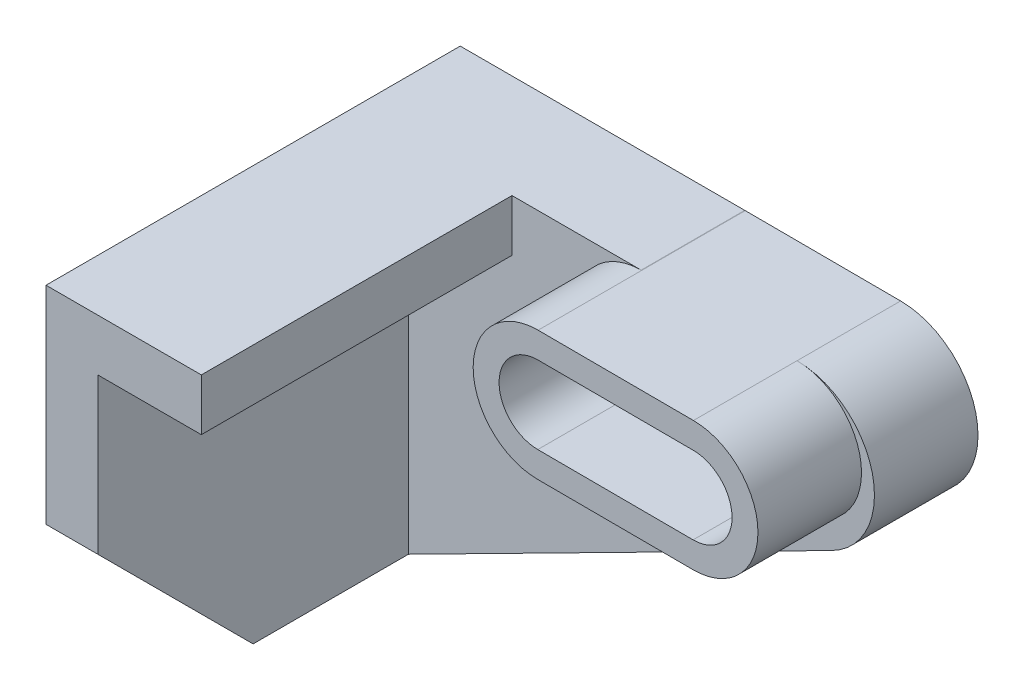
ISO-10303-21;
HEADER;
FILE_DESCRIPTION(('STEP AP214'),'2;1');
FILE_NAME('part.step','',(''),(''),'','','');
FILE_SCHEMA(('AUTOMOTIVE_DESIGN { 1 0 10303 214 1 1 1 1 }'));
ENDSEC;
DATA;
#1=APPLICATION_CONTEXT('core data for automotive mechanical design processes');
#2=APPLICATION_PROTOCOL_DEFINITION('international standard','automotive_design',2000,#1);
#3=PRODUCT_CONTEXT('',#1,'mechanical');
#4=PRODUCT('Part','Part','',(#3));
#5=PRODUCT_RELATED_PRODUCT_CATEGORY('part','',(#4));
#6=PRODUCT_DEFINITION_FORMATION('','',#4);
#7=PRODUCT_DEFINITION_CONTEXT('part definition',#1,'design');
#8=PRODUCT_DEFINITION('design','',#6,#7);
#9=PRODUCT_DEFINITION_SHAPE('','',#8);
#10=(LENGTH_UNIT() NAMED_UNIT(*) SI_UNIT(.MILLI.,.METRE.));
#11=(NAMED_UNIT(*) PLANE_ANGLE_UNIT() SI_UNIT($,.RADIAN.));
#12=(NAMED_UNIT(*) SI_UNIT($,.STERADIAN.) SOLID_ANGLE_UNIT());
#13=UNCERTAINTY_MEASURE_WITH_UNIT(LENGTH_MEASURE(1.E-05),#10,'distance_accuracy_value','');
#14=(GEOMETRIC_REPRESENTATION_CONTEXT(3) GLOBAL_UNCERTAINTY_ASSIGNED_CONTEXT((#13)) GLOBAL_UNIT_ASSIGNED_CONTEXT((#10,
#11,#12)) REPRESENTATION_CONTEXT('',''));
#15=CARTESIAN_POINT('',(0.,0.,0.));
#16=DIRECTION('',(0.,0.,1.));
#17=DIRECTION('',(1.,0.,0.));
#18=AXIS2_PLACEMENT_3D('',#15,#16,#17);
#19=CARTESIAN_POINT('',(0.,15.1056589097751,20.));
#20=DIRECTION('',(0.,-1.,0.));
#21=DIRECTION('',(1.,0.,0.));
#22=AXIS2_PLACEMENT_3D('',#19,#20,#21);
#23=PLANE('',#22);
#24=DIRECTION('',(0.,0.,-1.));
#25=VECTOR('',#24,1.);
#26=CARTESIAN_POINT('',(-30.0522937747598,15.1056589097751,40.));
#27=LINE('',#26,#25);
#28=CARTESIAN_POINT('',(-30.0522937747598,15.1056589097751,0.));
#29=VERTEX_POINT('',#28);
#30=CARTESIAN_POINT('',(-30.0522937747598,15.1056589097751,20.));
#31=VERTEX_POINT('',#30);
#32=EDGE_CURVE('E231',#29,#31,#27,.F.);
#33=ORIENTED_EDGE('',*,*,#32,.F.);
#34=DIRECTION('',(-1.,0.,0.));
#35=VECTOR('',#34,1.);
#36=CARTESIAN_POINT('',(0.,15.1056589097751,0.));
#37=LINE('',#36,#35);
#38=CARTESIAN_POINT('',(-85.,15.1056589097751,0.));
#39=VERTEX_POINT('',#38);
#40=EDGE_CURVE('E282',#29,#39,#37,.T.);
#41=ORIENTED_EDGE('',*,*,#40,.T.);
#42=DIRECTION('',(0.,0.,-1.));
#43=VECTOR('',#42,1.);
#44=CARTESIAN_POINT('',(-85.,15.1056589097751,80.));
#45=LINE('',#44,#43);
#46=CARTESIAN_POINT('',(-85.,15.1056589097751,80.));
#47=VERTEX_POINT('',#46);
#48=EDGE_CURVE('E271',#47,#39,#45,.T.);
#49=ORIENTED_EDGE('',*,*,#48,.F.);
#50=DIRECTION('',(-1.,0.,0.));
#51=VECTOR('',#50,1.);
#52=CARTESIAN_POINT('',(-55.,15.1056589097751,80.));
#53=LINE('',#52,#51);
#54=CARTESIAN_POINT('',(-55.,15.1056589097751,80.));
#55=VERTEX_POINT('',#54);
#56=EDGE_CURVE('E247',#55,#47,#53,.T.);
#57=ORIENTED_EDGE('',*,*,#56,.F.);
#58=DIRECTION('',(0.,0.,-1.));
#59=VECTOR('',#58,1.);
#60=CARTESIAN_POINT('',(-55.,15.1056589097751,80.));
#61=LINE('',#60,#59);
#62=CARTESIAN_POINT('',(-55.,15.1056589097751,20.));
#63=VERTEX_POINT('',#62);
#64=EDGE_CURVE('E274',#55,#63,#61,.T.);
#65=ORIENTED_EDGE('',*,*,#64,.T.);
#66=DIRECTION('',(-1.,0.,0.));
#67=VECTOR('',#66,1.);
#68=CARTESIAN_POINT('',(0.,15.1056589097751,20.));
#69=LINE('',#68,#67);
#70=EDGE_CURVE('E287',#31,#63,#69,.T.);
#71=ORIENTED_EDGE('',*,*,#70,.F.);
#72=EDGE_LOOP('',(#33,#41,#49,#57,#65,#71));
#73=FACE_BOUND('',#72,.T.);
#74=ADVANCED_FACE('F35',(#73),#23,.F.);
#75=CARTESIAN_POINT('',(0.,0.,20.));
#76=DIRECTION('',(0.,0.,1.));
#77=DIRECTION('',(1.,0.,0.));
#78=AXIS2_PLACEMENT_3D('',#75,#76,#77);
#79=PLANE('',#78);
#80=CARTESIAN_POINT('',(0.,0.,20.));
#81=DIRECTION('',(0.,0.,1.));
#82=DIRECTION('',(1.,0.,0.));
#83=AXIS2_PLACEMENT_3D('',#80,#81,#82);
#84=CIRCLE('',#83,15.);
#85=CARTESIAN_POINT('',(6.78973399532052,-13.3753322303705,20.));
#86=VERTEX_POINT('',#85);
#87=CARTESIAN_POINT('',(0.0528760398409213,14.9999036972708,20.));
#88=VERTEX_POINT('',#87);
#89=EDGE_CURVE('E281',#86,#88,#84,.T.);
#90=ORIENTED_EDGE('',*,*,#89,.T.);
#91=CARTESIAN_POINT('',(0.,2.50001553279464,20.));
#92=DIRECTION('',(0.,0.,1.));
#93=DIRECTION('',(1.,0.,0.));
#94=AXIS2_PLACEMENT_3D('',#91,#92,#93);
#95=CIRCLE('',#94,12.5);
#96=CARTESIAN_POINT('',(-0.0440633774849681,-9.99990680371469,20.));
#97=VERTEX_POINT('',#96);
#98=EDGE_CURVE('E233',#88,#97,#95,.F.);
#99=ORIENTED_EDGE('',*,*,#98,.T.);
#100=DIRECTION('',(-0.999993786920746,0.00352507019879746,0.));
#101=VECTOR('',#100,1.);
#102=CARTESIAN_POINT('',(-0.0352507019879747,-9.99993786920746,20.));
#103=LINE('',#102,#101);
#104=CARTESIAN_POINT('',(-30.044063377485,-9.89415404070046,20.));
#105=VERTEX_POINT('',#104);
#106=EDGE_CURVE('E225',#97,#105,#103,.T.);
#107=ORIENTED_EDGE('',*,*,#106,.T.);
#108=CARTESIAN_POINT('',(-30.,2.60576829580886,20.));
#109=DIRECTION('',(0.,0.,1.));
#110=DIRECTION('',(1.,0.,0.));
#111=AXIS2_PLACEMENT_3D('',#108,#109,#110);
#112=CIRCLE('',#111,12.5);
#113=EDGE_CURVE('E228',#105,#31,#112,.F.);
#114=ORIENTED_EDGE('',*,*,#113,.T.);
#115=ORIENTED_EDGE('',*,*,#70,.T.);
#116=DIRECTION('',(0.,-1.,0.));
#117=VECTOR('',#116,1.);
#118=CARTESIAN_POINT('',(-55.,0.,20.));
#119=LINE('',#118,#117);
#120=CARTESIAN_POINT('',(-55.,5.10565890977509,20.));
#121=VERTEX_POINT('',#120);
#122=EDGE_CURVE('E289',#63,#121,#119,.T.);
#123=ORIENTED_EDGE('',*,*,#122,.T.);
#124=DIRECTION('',(-1.,0.,0.));
#125=VECTOR('',#124,1.);
#126=CARTESIAN_POINT('',(0.,5.1056589097751,20.));
#127=LINE('',#126,#125);
#128=CARTESIAN_POINT('',(-75.,5.10565890977509,20.));
#129=VERTEX_POINT('',#128);
#130=EDGE_CURVE('E291',#121,#129,#127,.T.);
#131=ORIENTED_EDGE('',*,*,#130,.T.);
#132=DIRECTION('',(0.,-1.,0.));
#133=VECTOR('',#132,1.);
#134=CARTESIAN_POINT('',(-75.,0.,20.));
#135=LINE('',#134,#133);
#136=CARTESIAN_POINT('',(-75.,-54.8943410902249,20.));
#137=VERTEX_POINT('',#136);
#138=EDGE_CURVE('E293',#129,#137,#135,.T.);
#139=ORIENTED_EDGE('',*,*,#138,.T.);
#140=DIRECTION('',(0.891688815358036,0.452648933021368,0.));
#141=VECTOR('',#140,1.);
#142=CARTESIAN_POINT('',(6.78973399532052,-13.3753322303705,20.));
#143=LINE('',#142,#141);
#144=EDGE_CURVE('E278',#137,#86,#143,.T.);
#145=ORIENTED_EDGE('',*,*,#144,.T.);
#146=EDGE_LOOP('',(#90,#99,#107,#114,#115,#123,#131,#139,#145));
#147=FACE_BOUND('',#146,.T.);
#148=ADVANCED_FACE('F338',(#147),#79,.T.);
#149=CARTESIAN_POINT('',(6.78973399532052,-13.3753322303705,20.));
#150=DIRECTION('',(-0.452648933021368,0.891688815358036,0.));
#151=DIRECTION('',(-0.891688815358036,-0.452648933021368,0.));
#152=AXIS2_PLACEMENT_3D('',#149,#150,#151);
#153=PLANE('',#152);
#154=DIRECTION('',(0.891688815358036,0.452648933021368,0.));
#155=VECTOR('',#154,1.);
#156=CARTESIAN_POINT('',(6.78973399532052,-13.3753322303705,0.));
#157=LINE('',#156,#155);
#158=CARTESIAN_POINT('',(-75.,-54.8943410902249,0.));
#159=VERTEX_POINT('',#158);
#160=CARTESIAN_POINT('',(6.78973399532052,-13.3753322303705,0.));
#161=VERTEX_POINT('',#160);
#162=EDGE_CURVE('E277',#159,#161,#157,.T.);
#163=ORIENTED_EDGE('',*,*,#162,.T.);
#164=DIRECTION('',(0.,0.,-1.));
#165=VECTOR('',#164,1.);
#166=CARTESIAN_POINT('',(6.78973399532052,-13.3753322303705,20.));
#167=LINE('',#166,#165);
#168=EDGE_CURVE('E43',#86,#161,#167,.T.);
#169=ORIENTED_EDGE('',*,*,#168,.F.);
#170=ORIENTED_EDGE('',*,*,#144,.F.);
#171=DIRECTION('',(0.,0.,-1.));
#172=VECTOR('',#171,1.);
#173=CARTESIAN_POINT('',(-75.,-54.8943410902249,20.));
#174=LINE('',#173,#172);
#175=EDGE_CURVE('E296',#137,#159,#174,.T.);
#176=ORIENTED_EDGE('',*,*,#175,.T.);
#177=EDGE_LOOP('',(#163,#169,#170,#176));
#178=FACE_BOUND('',#177,.T.);
#179=ADVANCED_FACE('F37',(#178),#153,.F.);
#180=CARTESIAN_POINT('',(0.,0.,20.));
#181=DIRECTION('',(0.,0.,-1.));
#182=DIRECTION('',(-1.,0.,0.));
#183=AXIS2_PLACEMENT_3D('',#180,#181,#182);
#184=CYLINDRICAL_SURFACE('',#183,15.);
#185=CARTESIAN_POINT('',(0.,0.,0.));
#186=DIRECTION('',(0.,0.,1.));
#187=DIRECTION('',(1.,0.,0.));
#188=AXIS2_PLACEMENT_3D('',#185,#186,#187);
#189=CIRCLE('',#188,15.);
#190=CARTESIAN_POINT('',(0.0528760529819632,14.9999068038112,0.));
#191=VERTEX_POINT('',#190);
#192=EDGE_CURVE('E299',#161,#191,#189,.T.);
#193=ORIENTED_EDGE('',*,*,#192,.T.);
#194=DIRECTION('',(0.,0.,-1.));
#195=VECTOR('',#194,1.);
#196=CARTESIAN_POINT('',(0.0528760529819632,14.9999068038112,20.));
#197=LINE('',#196,#195);
#198=EDGE_CURVE('E305',#88,#191,#197,.T.);
#199=ORIENTED_EDGE('',*,*,#198,.F.);
#200=ORIENTED_EDGE('',*,*,#89,.F.);
#201=ORIENTED_EDGE('',*,*,#168,.T.);
#202=EDGE_LOOP('',(#193,#199,#200,#201));
#203=FACE_BOUND('',#202,.T.);
#204=ADVANCED_FACE('F310',(#203),#184,.T.);
#205=CARTESIAN_POINT('',(0.052876052981962,14.9999068038112,20.));
#206=DIRECTION('',(-0.00352507019879747,-0.999993786920746,0.));
#207=DIRECTION('',(0.999993786920746,-0.00352507019879747,0.));
#208=AXIS2_PLACEMENT_3D('',#205,#206,#207);
#209=PLANE('',#208);
#210=DIRECTION('',(-0.999993786920746,0.00352507019879747,0.));
#211=VECTOR('',#210,1.);
#212=CARTESIAN_POINT('',(0.052876052981962,14.9999068038112,0.));
#213=LINE('',#212,#211);
#214=CARTESIAN_POINT('',(-29.955936622515,15.1056906323182,0.));
#215=VERTEX_POINT('',#214);
#216=EDGE_CURVE('E301',#191,#215,#213,.T.);
#217=ORIENTED_EDGE('',*,*,#216,.T.);
#218=DIRECTION('',(0.,0.,-1.));
#219=VECTOR('',#218,1.);
#220=CARTESIAN_POINT('',(-29.955936622515,15.1056906323182,40.));
#221=LINE('',#220,#219);
#222=CARTESIAN_POINT('',(-29.955936622515,15.1056906323182,40.));
#223=VERTEX_POINT('',#222);
#224=EDGE_CURVE('E211',#223,#215,#221,.T.);
#225=ORIENTED_EDGE('',*,*,#224,.F.);
#226=DIRECTION('',(-0.999993786920745,0.00352507019879764,0.));
#227=VECTOR('',#226,1.);
#228=CARTESIAN_POINT('',(0.0440633774849681,14.999937869304,40.));
#229=LINE('',#228,#227);
#230=CARTESIAN_POINT('',(0.0440633774849681,14.999937869304,40.));
#231=VERTEX_POINT('',#230);
#232=EDGE_CURVE('E200',#231,#223,#229,.T.);
#233=ORIENTED_EDGE('',*,*,#232,.F.);
#234=DIRECTION('',(0.,0.,-1.));
#235=VECTOR('',#234,1.);
#236=CARTESIAN_POINT('',(0.0440633774849681,14.999937869304,40.));
#237=LINE('',#236,#235);
#238=CARTESIAN_POINT('',(0.0440633774849681,14.999937869304,20.));
#239=VERTEX_POINT('',#238);
#240=EDGE_CURVE('E214',#231,#239,#237,.T.);
#241=ORIENTED_EDGE('',*,*,#240,.T.);
#242=DIRECTION('',(-0.999993786920746,0.00352507019879747,0.));
#243=VECTOR('',#242,1.);
#244=CARTESIAN_POINT('',(0.052876052981962,14.9999068038112,20.));
#245=LINE('',#244,#243);
#246=EDGE_CURVE('E285',#88,#239,#245,.T.);
#247=ORIENTED_EDGE('',*,*,#246,.F.);
#248=ORIENTED_EDGE('',*,*,#198,.T.);
#249=EDGE_LOOP('',(#217,#225,#233,#241,#247,#248));
#250=FACE_BOUND('',#249,.T.);
#251=ADVANCED_FACE('F350',(#250),#209,.F.);
#252=CARTESIAN_POINT('',(0.,0.,0.));
#253=DIRECTION('',(0.,0.,1.));
#254=DIRECTION('',(1.,0.,0.));
#255=AXIS2_PLACEMENT_3D('',#252,#253,#254);
#256=PLANE('',#255);
#257=ORIENTED_EDGE('',*,*,#40,.F.);
#258=CARTESIAN_POINT('',(-30.,2.60576829580886,0.));
#259=DIRECTION('',(0.,0.,1.));
#260=DIRECTION('',(1.,0.,0.));
#261=AXIS2_PLACEMENT_3D('',#258,#259,#260);
#262=CIRCLE('',#261,12.5);
#263=EDGE_CURVE('E180',#215,#29,#262,.T.);
#264=ORIENTED_EDGE('',*,*,#263,.F.);
#265=ORIENTED_EDGE('',*,*,#216,.F.);
#266=ORIENTED_EDGE('',*,*,#192,.F.);
#267=ORIENTED_EDGE('',*,*,#162,.F.);
#268=DIRECTION('',(1.,0.,0.));
#269=VECTOR('',#268,1.);
#270=CARTESIAN_POINT('',(-85.,-54.8943410902249,0.));
#271=LINE('',#270,#269);
#272=CARTESIAN_POINT('',(-85.,-54.8943410902249,0.));
#273=VERTEX_POINT('',#272);
#274=EDGE_CURVE('E248',#273,#159,#271,.T.);
#275=ORIENTED_EDGE('',*,*,#274,.F.);
#276=DIRECTION('',(0.,-1.,0.));
#277=VECTOR('',#276,1.);
#278=CARTESIAN_POINT('',(-85.,15.1056589097751,0.));
#279=LINE('',#278,#277);
#280=EDGE_CURVE('E243',#39,#273,#279,.T.);
#281=ORIENTED_EDGE('',*,*,#280,.F.);
#282=EDGE_LOOP('',(#257,#264,#265,#266,#267,#275,#281));
#283=FACE_BOUND('',#282,.T.);
#284=ADVANCED_FACE('F319',(#283),#256,.F.);
#285=CARTESIAN_POINT('',(-55.,5.10565890977509,80.));
#286=DIRECTION('',(-1.,0.,0.));
#287=DIRECTION('',(0.,0.,1.));
#288=AXIS2_PLACEMENT_3D('',#285,#286,#287);
#289=PLANE('',#288);
#290=ORIENTED_EDGE('',*,*,#122,.F.);
#291=ORIENTED_EDGE('',*,*,#64,.F.);
#292=DIRECTION('',(0.,1.,0.));
#293=VECTOR('',#292,1.);
#294=CARTESIAN_POINT('',(-55.,5.10565890977509,80.));
#295=LINE('',#294,#293);
#296=CARTESIAN_POINT('',(-55.,5.10565890977509,80.));
#297=VERTEX_POINT('',#296);
#298=EDGE_CURVE('E244',#297,#55,#295,.T.);
#299=ORIENTED_EDGE('',*,*,#298,.F.);
#300=DIRECTION('',(0.,0.,-1.));
#301=VECTOR('',#300,1.);
#302=CARTESIAN_POINT('',(-55.,5.10565890977509,80.));
#303=LINE('',#302,#301);
#304=EDGE_CURVE('E257',#297,#121,#303,.T.);
#305=ORIENTED_EDGE('',*,*,#304,.T.);
#306=EDGE_LOOP('',(#290,#291,#299,#305));
#307=FACE_BOUND('',#306,.T.);
#308=ADVANCED_FACE('F358',(#307),#289,.F.);
#309=CARTESIAN_POINT('',(-85.,15.1056589097751,80.));
#310=DIRECTION('',(1.,0.,0.));
#311=DIRECTION('',(0.,1.,0.));
#312=AXIS2_PLACEMENT_3D('',#309,#310,#311);
#313=PLANE('',#312);
#314=DIRECTION('',(0.,0.,-1.));
#315=VECTOR('',#314,1.);
#316=CARTESIAN_POINT('',(-85.,-54.8943410902249,80.));
#317=LINE('',#316,#315);
#318=CARTESIAN_POINT('',(-85.,-54.8943410902249,50.));
#319=VERTEX_POINT('',#318);
#320=EDGE_CURVE('E269',#319,#273,#317,.T.);
#321=ORIENTED_EDGE('',*,*,#320,.F.);
#322=DIRECTION('',(0.,0.707106781186547,0.707106781186548));
#323=VECTOR('',#322,1.);
#324=CARTESIAN_POINT('',(-85.,-4.89434109022492,100.));
#325=LINE('',#324,#323);
#326=CARTESIAN_POINT('',(-85.,-24.8943410902249,80.));
#327=VERTEX_POINT('',#326);
#328=EDGE_CURVE('E240',#319,#327,#325,.T.);
#329=ORIENTED_EDGE('',*,*,#328,.T.);
#330=DIRECTION('',(0.,-1.,0.));
#331=VECTOR('',#330,1.);
#332=CARTESIAN_POINT('',(-85.,15.1056589097751,80.));
#333=LINE('',#332,#331);
#334=EDGE_CURVE('E250',#47,#327,#333,.T.);
#335=ORIENTED_EDGE('',*,*,#334,.F.);
#336=ORIENTED_EDGE('',*,*,#48,.T.);
#337=ORIENTED_EDGE('',*,*,#280,.T.);
#338=EDGE_LOOP('',(#321,#329,#335,#336,#337));
#339=FACE_BOUND('',#338,.T.);
#340=ADVANCED_FACE('F328',(#339),#313,.F.);
#341=CARTESIAN_POINT('',(-85.,-54.8943410902249,80.));
#342=DIRECTION('',(0.,1.,0.));
#343=DIRECTION('',(0.,0.,1.));
#344=AXIS2_PLACEMENT_3D('',#341,#342,#343);
#345=PLANE('',#344);
#346=DIRECTION('',(0.,0.,-1.));
#347=VECTOR('',#346,1.);
#348=CARTESIAN_POINT('',(-75.,-54.8943410902249,80.));
#349=LINE('',#348,#347);
#350=CARTESIAN_POINT('',(-75.,-54.8943410902249,50.));
#351=VERTEX_POINT('',#350);
#352=EDGE_CURVE('E267',#351,#137,#349,.T.);
#353=ORIENTED_EDGE('',*,*,#352,.F.);
#354=DIRECTION('',(1.,0.,0.));
#355=VECTOR('',#354,1.);
#356=CARTESIAN_POINT('',(-155.,-54.8943410902249,50.));
#357=LINE('',#356,#355);
#358=EDGE_CURVE('E238',#319,#351,#357,.T.);
#359=ORIENTED_EDGE('',*,*,#358,.F.);
#360=ORIENTED_EDGE('',*,*,#320,.T.);
#361=ORIENTED_EDGE('',*,*,#274,.T.);
#362=ORIENTED_EDGE('',*,*,#175,.F.);
#363=EDGE_LOOP('',(#353,#359,#360,#361,#362));
#364=FACE_BOUND('',#363,.T.);
#365=ADVANCED_FACE('F324',(#364),#345,.F.);
#366=CARTESIAN_POINT('',(-75.,-54.8943410902249,80.));
#367=DIRECTION('',(-1.,0.,0.));
#368=DIRECTION('',(0.,-1.,0.));
#369=AXIS2_PLACEMENT_3D('',#366,#367,#368);
#370=PLANE('',#369);
#371=DIRECTION('',(0.,1.,0.));
#372=VECTOR('',#371,1.);
#373=CARTESIAN_POINT('',(-75.,-54.8943410902249,80.));
#374=LINE('',#373,#372);
#375=CARTESIAN_POINT('',(-75.,-24.8943410902249,80.));
#376=VERTEX_POINT('',#375);
#377=CARTESIAN_POINT('',(-75.,5.10565890977509,80.));
#378=VERTEX_POINT('',#377);
#379=EDGE_CURVE('E253',#376,#378,#374,.T.);
#380=ORIENTED_EDGE('',*,*,#379,.F.);
#381=DIRECTION('',(0.,0.707106781186547,0.707106781186548));
#382=VECTOR('',#381,1.);
#383=CARTESIAN_POINT('',(-75.,-24.8943410902249,80.));
#384=LINE('',#383,#382);
#385=EDGE_CURVE('E236',#351,#376,#384,.T.);
#386=ORIENTED_EDGE('',*,*,#385,.F.);
#387=ORIENTED_EDGE('',*,*,#352,.T.);
#388=ORIENTED_EDGE('',*,*,#138,.F.);
#389=DIRECTION('',(0.,0.,-1.));
#390=VECTOR('',#389,1.);
#391=CARTESIAN_POINT('',(-75.,5.10565890977509,80.));
#392=LINE('',#391,#390);
#393=EDGE_CURVE('E264',#378,#129,#392,.T.);
#394=ORIENTED_EDGE('',*,*,#393,.F.);
#395=EDGE_LOOP('',(#380,#386,#387,#388,#394));
#396=FACE_BOUND('',#395,.T.);
#397=ADVANCED_FACE('F377',(#396),#370,.F.);
#398=CARTESIAN_POINT('',(-75.,5.10565890977509,80.));
#399=DIRECTION('',(0.,1.,0.));
#400=DIRECTION('',(-1.,0.,0.));
#401=AXIS2_PLACEMENT_3D('',#398,#399,#400);
#402=PLANE('',#401);
#403=ORIENTED_EDGE('',*,*,#130,.F.);
#404=ORIENTED_EDGE('',*,*,#304,.F.);
#405=DIRECTION('',(1.,0.,0.));
#406=VECTOR('',#405,1.);
#407=CARTESIAN_POINT('',(-75.,5.10565890977509,80.));
#408=LINE('',#407,#406);
#409=EDGE_CURVE('E255',#378,#297,#408,.T.);
#410=ORIENTED_EDGE('',*,*,#409,.F.);
#411=ORIENTED_EDGE('',*,*,#393,.T.);
#412=EDGE_LOOP('',(#403,#404,#410,#411));
#413=FACE_BOUND('',#412,.T.);
#414=ADVANCED_FACE('F380',(#413),#402,.F.);
#415=CARTESIAN_POINT('',(0.,0.,80.));
#416=DIRECTION('',(0.,0.,1.));
#417=DIRECTION('',(1.,0.,0.));
#418=AXIS2_PLACEMENT_3D('',#415,#416,#417);
#419=PLANE('',#418);
#420=DIRECTION('',(-1.,0.,0.));
#421=VECTOR('',#420,1.);
#422=CARTESIAN_POINT('',(0.,-24.8943410902249,80.));
#423=LINE('',#422,#421);
#424=EDGE_CURVE('E11',#376,#327,#423,.T.);
#425=ORIENTED_EDGE('',*,*,#424,.F.);
#426=ORIENTED_EDGE('',*,*,#379,.T.);
#427=ORIENTED_EDGE('',*,*,#409,.T.);
#428=ORIENTED_EDGE('',*,*,#298,.T.);
#429=ORIENTED_EDGE('',*,*,#56,.T.);
#430=ORIENTED_EDGE('',*,*,#334,.T.);
#431=EDGE_LOOP('',(#425,#426,#427,#428,#429,#430));
#432=FACE_BOUND('',#431,.T.);
#433=ADVANCED_FACE('F384',(#432),#419,.T.);
#434=CARTESIAN_POINT('',(-155.,-24.8943410902249,80.));
#435=DIRECTION('',(0.,0.707106781186548,-0.707106781186547));
#436=DIRECTION('',(0.,0.707106781186547,0.707106781186548));
#437=AXIS2_PLACEMENT_3D('',#434,#435,#436);
#438=PLANE('',#437);
#439=ORIENTED_EDGE('',*,*,#358,.T.);
#440=ORIENTED_EDGE('',*,*,#385,.T.);
#441=ORIENTED_EDGE('',*,*,#424,.T.);
#442=ORIENTED_EDGE('',*,*,#328,.F.);
#443=EDGE_LOOP('',(#439,#440,#441,#442));
#444=FACE_BOUND('',#443,.T.);
#445=ADVANCED_FACE('F388',(#444),#438,.F.);
#446=CARTESIAN_POINT('',(-30.,2.60576829580886,40.));
#447=DIRECTION('',(0.,0.,-1.));
#448=DIRECTION('',(-1.,0.,0.));
#449=AXIS2_PLACEMENT_3D('',#446,#447,#448);
#450=CYLINDRICAL_SURFACE('',#449,12.5);
#451=ORIENTED_EDGE('',*,*,#263,.T.);
#452=ORIENTED_EDGE('',*,*,#32,.T.);
#453=ORIENTED_EDGE('',*,*,#113,.F.);
#454=DIRECTION('',(0.,0.,-1.));
#455=VECTOR('',#454,1.);
#456=CARTESIAN_POINT('',(-30.044063377485,-9.89415404070046,40.));
#457=LINE('',#456,#455);
#458=CARTESIAN_POINT('',(-30.044063377485,-9.89415404070046,40.));
#459=VERTEX_POINT('',#458);
#460=EDGE_CURVE('E50',#459,#105,#457,.T.);
#461=ORIENTED_EDGE('',*,*,#460,.F.);
#462=CARTESIAN_POINT('',(-30.,2.60576829580886,40.));
#463=DIRECTION('',(0.,0.,1.));
#464=DIRECTION('',(1.,0.,0.));
#465=AXIS2_PLACEMENT_3D('',#462,#463,#464);
#466=CIRCLE('',#465,12.5);
#467=EDGE_CURVE('E202',#223,#459,#466,.T.);
#468=ORIENTED_EDGE('',*,*,#467,.F.);
#469=ORIENTED_EDGE('',*,*,#224,.T.);
#470=EDGE_LOOP('',(#451,#452,#453,#461,#468,#469));
#471=FACE_BOUND('',#470,.T.);
#472=ADVANCED_FACE('F336',(#471),#450,.T.);
#473=CARTESIAN_POINT('',(0.,2.50001553279464,40.));
#474=DIRECTION('',(0.,0.,1.));
#475=DIRECTION('',(1.,0.,0.));
#476=AXIS2_PLACEMENT_3D('',#473,#474,#475);
#477=PLANE('',#476);
#478=CARTESIAN_POINT('',(0.,2.50001553279464,40.));
#479=DIRECTION('',(0.,0.,1.));
#480=DIRECTION('',(1.,0.,0.));
#481=AXIS2_PLACEMENT_3D('',#478,#479,#480);
#482=CIRCLE('',#481,12.5);
#483=CARTESIAN_POINT('',(-0.0440633774849681,-9.99990680371469,40.));
#484=VERTEX_POINT('',#483);
#485=EDGE_CURVE('E197',#484,#231,#482,.T.);
#486=ORIENTED_EDGE('',*,*,#485,.T.);
#487=ORIENTED_EDGE('',*,*,#232,.T.);
#488=ORIENTED_EDGE('',*,*,#467,.T.);
#489=DIRECTION('',(0.999993786920746,-0.00352507019879746,0.));
#490=VECTOR('',#489,1.);
#491=CARTESIAN_POINT('',(-0.0440633774849681,-9.99990680371469,40.));
#492=LINE('',#491,#490);
#493=EDGE_CURVE('E204',#459,#484,#492,.T.);
#494=ORIENTED_EDGE('',*,*,#493,.T.);
#495=EDGE_LOOP('',(#486,#487,#488,#494));
#496=FACE_BOUND('',#495,.T.);
#497=DIRECTION('',(-0.999993786920746,0.00352507019879746,0.));
#498=VECTOR('',#497,1.);
#499=CARTESIAN_POINT('',(0.0264380264909808,9.99996893470022,40.));
#500=LINE('',#499,#498);
#501=CARTESIAN_POINT('',(0.0264380264909808,9.99996893470022,40.));
#502=VERTEX_POINT('',#501);
#503=CARTESIAN_POINT('',(-29.973561973509,10.1057216977144,40.));
#504=VERTEX_POINT('',#503);
#505=EDGE_CURVE('E173',#502,#504,#500,.T.);
#506=ORIENTED_EDGE('',*,*,#505,.F.);
#507=CARTESIAN_POINT('',(0.,2.50001553279464,40.));
#508=DIRECTION('',(0.,0.,1.));
#509=DIRECTION('',(1.,0.,0.));
#510=AXIS2_PLACEMENT_3D('',#507,#508,#509);
#511=CIRCLE('',#510,7.49999999999999);
#512=CARTESIAN_POINT('',(-0.0264380264909808,-4.99993786911094,40.));
#513=VERTEX_POINT('',#512);
#514=EDGE_CURVE('E164',#513,#502,#511,.T.);
#515=ORIENTED_EDGE('',*,*,#514,.F.);
#516=DIRECTION('',(0.999993786920746,-0.00352507019879741,0.));
#517=VECTOR('',#516,1.);
#518=CARTESIAN_POINT('',(-0.0264380264909808,-4.99993786911094,40.));
#519=LINE('',#518,#517);
#520=CARTESIAN_POINT('',(-30.026438026491,-4.89418510609672,40.));
#521=VERTEX_POINT('',#520);
#522=EDGE_CURVE('E188',#521,#513,#519,.T.);
#523=ORIENTED_EDGE('',*,*,#522,.F.);
#524=CARTESIAN_POINT('',(-30.,2.60576829580886,40.));
#525=DIRECTION('',(0.,0.,1.));
#526=DIRECTION('',(1.,0.,0.));
#527=AXIS2_PLACEMENT_3D('',#524,#525,#526);
#528=CIRCLE('',#527,7.49999999999999);
#529=EDGE_CURVE('E186',#504,#521,#528,.T.);
#530=ORIENTED_EDGE('',*,*,#529,.F.);
#531=EDGE_LOOP('',(#506,#515,#523,#530));
#532=FACE_BOUND('',#531,.T.);
#533=ADVANCED_FACE('F184',(#496,#532),#477,.T.);
#534=CARTESIAN_POINT('',(0.,2.50001553279464,40.));
#535=DIRECTION('',(0.,0.,-1.));
#536=DIRECTION('',(-1.,0.,0.));
#537=AXIS2_PLACEMENT_3D('',#534,#535,#536);
#538=CYLINDRICAL_SURFACE('',#537,12.5);
#539=ORIENTED_EDGE('',*,*,#246,.T.);
#540=ORIENTED_EDGE('',*,*,#240,.F.);
#541=ORIENTED_EDGE('',*,*,#485,.F.);
#542=DIRECTION('',(0.,0.,-1.));
#543=VECTOR('',#542,1.);
#544=CARTESIAN_POINT('',(-0.0440633774849681,-9.99990680371469,40.));
#545=LINE('',#544,#543);
#546=EDGE_CURVE('E206',#484,#97,#545,.T.);
#547=ORIENTED_EDGE('',*,*,#546,.T.);
#548=ORIENTED_EDGE('',*,*,#98,.F.);
#549=EDGE_LOOP('',(#539,#540,#541,#547,#548));
#550=FACE_BOUND('',#549,.T.);
#551=ADVANCED_FACE('F344',(#550),#538,.T.);
#552=CARTESIAN_POINT('',(-0.0440633774849681,-9.99990680371469,40.));
#553=DIRECTION('',(0.00352507019879746,0.999993786920746,0.));
#554=DIRECTION('',(-0.999993786920746,0.00352507019879746,0.));
#555=AXIS2_PLACEMENT_3D('',#552,#553,#554);
#556=PLANE('',#555);
#557=ORIENTED_EDGE('',*,*,#106,.F.);
#558=ORIENTED_EDGE('',*,*,#546,.F.);
#559=ORIENTED_EDGE('',*,*,#493,.F.);
#560=ORIENTED_EDGE('',*,*,#460,.T.);
#561=EDGE_LOOP('',(#557,#558,#559,#560));
#562=FACE_BOUND('',#561,.T.);
#563=ADVANCED_FACE('F341',(#562),#556,.F.);
#564=CARTESIAN_POINT('',(0.,2.50001553279464,40.));
#565=DIRECTION('',(0.,0.,-1.));
#566=DIRECTION('',(-1.,0.,0.));
#567=AXIS2_PLACEMENT_3D('',#564,#565,#566);
#568=CYLINDRICAL_SURFACE('',#567,7.49999999999999);
#569=DIRECTION('',(0.,0.,-1.));
#570=VECTOR('',#569,1.);
#571=CARTESIAN_POINT('',(0.0264380264909808,9.99996893470022,40.));
#572=LINE('',#571,#570);
#573=CARTESIAN_POINT('',(0.0264380264909808,9.99996893470022,20.));
#574=VERTEX_POINT('',#573);
#575=EDGE_CURVE('E167',#502,#574,#572,.T.);
#576=ORIENTED_EDGE('',*,*,#575,.T.);
#577=CARTESIAN_POINT('',(0.,2.50001553279464,20.));
#578=DIRECTION('',(0.,0.,1.));
#579=DIRECTION('',(1.,0.,0.));
#580=AXIS2_PLACEMENT_3D('',#577,#578,#579);
#581=CIRCLE('',#580,7.49999999999999);
#582=CARTESIAN_POINT('',(-0.0264380264909808,-4.99993786911094,20.));
#583=VERTEX_POINT('',#582);
#584=EDGE_CURVE('E58',#574,#583,#581,.F.);
#585=ORIENTED_EDGE('',*,*,#584,.T.);
#586=DIRECTION('',(0.,0.,-1.));
#587=VECTOR('',#586,1.);
#588=CARTESIAN_POINT('',(-0.0264380264909808,-4.99993786911094,40.));
#589=LINE('',#588,#587);
#590=EDGE_CURVE('E169',#513,#583,#589,.T.);
#591=ORIENTED_EDGE('',*,*,#590,.F.);
#592=ORIENTED_EDGE('',*,*,#514,.T.);
#593=EDGE_LOOP('',(#576,#585,#591,#592));
#594=FACE_BOUND('',#593,.T.);
#595=ADVANCED_FACE('F166',(#594),#568,.F.);
#596=CARTESIAN_POINT('',(0.0264380264909808,9.99996893470022,40.));
#597=DIRECTION('',(-0.00352507019879746,-0.999993786920746,0.));
#598=DIRECTION('',(0.999993786920746,-0.00352507019879746,0.));
#599=AXIS2_PLACEMENT_3D('',#596,#597,#598);
#600=PLANE('',#599);
#601=DIRECTION('',(0.,0.,-1.));
#602=VECTOR('',#601,1.);
#603=CARTESIAN_POINT('',(-29.973561973509,10.1057216977144,40.));
#604=LINE('',#603,#602);
#605=CARTESIAN_POINT('',(-29.973561973509,10.1057216977144,20.));
#606=VERTEX_POINT('',#605);
#607=EDGE_CURVE('E181',#504,#606,#604,.T.);
#608=ORIENTED_EDGE('',*,*,#607,.T.);
#609=DIRECTION('',(0.999993786920746,-0.00352507019879746,0.));
#610=VECTOR('',#609,1.);
#611=CARTESIAN_POINT('',(0.0352507019879746,9.99993786920744,20.));
#612=LINE('',#611,#610);
#613=EDGE_CURVE('E179',#606,#574,#612,.T.);
#614=ORIENTED_EDGE('',*,*,#613,.T.);
#615=ORIENTED_EDGE('',*,*,#575,.F.);
#616=ORIENTED_EDGE('',*,*,#505,.T.);
#617=EDGE_LOOP('',(#608,#614,#615,#616));
#618=FACE_BOUND('',#617,.T.);
#619=ADVANCED_FACE('F177',(#618),#600,.T.);
#620=CARTESIAN_POINT('',(-30.,2.60576829580886,40.));
#621=DIRECTION('',(0.,0.,-1.));
#622=DIRECTION('',(-1.,0.,0.));
#623=AXIS2_PLACEMENT_3D('',#620,#621,#622);
#624=CYLINDRICAL_SURFACE('',#623,7.49999999999999);
#625=DIRECTION('',(0.,0.,-1.));
#626=VECTOR('',#625,1.);
#627=CARTESIAN_POINT('',(-30.026438026491,-4.89418510609672,40.));
#628=LINE('',#627,#626);
#629=CARTESIAN_POINT('',(-30.026438026491,-4.89418510609672,20.));
#630=VERTEX_POINT('',#629);
#631=EDGE_CURVE('E193',#521,#630,#628,.T.);
#632=ORIENTED_EDGE('',*,*,#631,.T.);
#633=CARTESIAN_POINT('',(-30.,2.60576829580886,20.));
#634=DIRECTION('',(0.,0.,1.));
#635=DIRECTION('',(1.,0.,0.));
#636=AXIS2_PLACEMENT_3D('',#633,#634,#635);
#637=CIRCLE('',#636,7.49999999999999);
#638=EDGE_CURVE('E220',#630,#606,#637,.F.);
#639=ORIENTED_EDGE('',*,*,#638,.T.);
#640=ORIENTED_EDGE('',*,*,#607,.F.);
#641=ORIENTED_EDGE('',*,*,#529,.T.);
#642=EDGE_LOOP('',(#632,#639,#640,#641));
#643=FACE_BOUND('',#642,.T.);
#644=ADVANCED_FACE('F405',(#643),#624,.F.);
#645=CARTESIAN_POINT('',(-0.0264380264909808,-4.99993786911094,40.));
#646=DIRECTION('',(0.00352507019879741,0.999993786920746,0.));
#647=DIRECTION('',(-0.999993786920746,0.00352507019879741,0.));
#648=AXIS2_PLACEMENT_3D('',#645,#646,#647);
#649=PLANE('',#648);
#650=ORIENTED_EDGE('',*,*,#590,.T.);
#651=DIRECTION('',(-0.999993786920746,0.00352507019879741,0.));
#652=VECTOR('',#651,1.);
#653=CARTESIAN_POINT('',(-0.017625350993987,-4.99996893460372,20.));
#654=LINE('',#653,#652);
#655=EDGE_CURVE('E217',#583,#630,#654,.T.);
#656=ORIENTED_EDGE('',*,*,#655,.T.);
#657=ORIENTED_EDGE('',*,*,#631,.F.);
#658=ORIENTED_EDGE('',*,*,#522,.T.);
#659=EDGE_LOOP('',(#650,#656,#657,#658));
#660=FACE_BOUND('',#659,.T.);
#661=ADVANCED_FACE('F369',(#660),#649,.T.);
#662=ORIENTED_EDGE('',*,*,#584,.F.);
#663=ORIENTED_EDGE('',*,*,#613,.F.);
#664=ORIENTED_EDGE('',*,*,#638,.F.);
#665=ORIENTED_EDGE('',*,*,#655,.F.);
#666=EDGE_LOOP('',(#662,#663,#664,#665));
#667=FACE_BOUND('',#666,.T.);
#668=ADVANCED_FACE('F366',(#667),#79,.T.);
#669=CLOSED_SHELL('',(#74,#148,#179,#204,#251,#284,#308,#340,#365,#397,#414,#433,#445,#472,#533,
#551,#563,#595,#619,#644,#661,#668));
#670=MANIFOLD_SOLID_BREP('B2',#669);
#671=ADVANCED_BREP_SHAPE_REPRESENTATION('',(#18,#670),#14);
#672=SHAPE_DEFINITION_REPRESENTATION(#9,#671);
ENDSEC;
END-ISO-10303-21;
